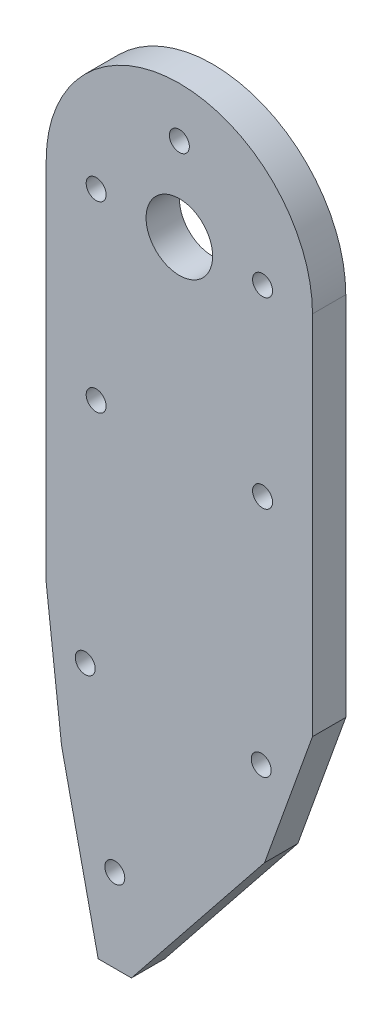
ISO-10303-21;
HEADER;
FILE_DESCRIPTION(('STEP AP214'),'2;1');
FILE_NAME('part.step','',(''),(''),'','','');
FILE_SCHEMA(('AUTOMOTIVE_DESIGN { 1 0 10303 214 1 1 1 1 }'));
ENDSEC;
DATA;
#1=APPLICATION_CONTEXT('core data for automotive mechanical design processes');
#2=APPLICATION_PROTOCOL_DEFINITION('international standard','automotive_design',2000,#1);
#3=PRODUCT_CONTEXT('',#1,'mechanical');
#4=PRODUCT('Part','Part','',(#3));
#5=PRODUCT_RELATED_PRODUCT_CATEGORY('part','',(#4));
#6=PRODUCT_DEFINITION_FORMATION('','',#4);
#7=PRODUCT_DEFINITION_CONTEXT('part definition',#1,'design');
#8=PRODUCT_DEFINITION('design','',#6,#7);
#9=PRODUCT_DEFINITION_SHAPE('','',#8);
#10=(LENGTH_UNIT() NAMED_UNIT(*) SI_UNIT(.MILLI.,.METRE.));
#11=(NAMED_UNIT(*) PLANE_ANGLE_UNIT() SI_UNIT($,.RADIAN.));
#12=(NAMED_UNIT(*) SI_UNIT($,.STERADIAN.) SOLID_ANGLE_UNIT());
#13=UNCERTAINTY_MEASURE_WITH_UNIT(LENGTH_MEASURE(1.E-05),#10,'distance_accuracy_value','');
#14=(GEOMETRIC_REPRESENTATION_CONTEXT(3) GLOBAL_UNCERTAINTY_ASSIGNED_CONTEXT((#13)) GLOBAL_UNIT_ASSIGNED_CONTEXT((#10,
#11,#12)) REPRESENTATION_CONTEXT('',''));
#15=CARTESIAN_POINT('',(0.,0.,0.));
#16=DIRECTION('',(0.,0.,1.));
#17=DIRECTION('',(1.,0.,0.));
#18=AXIS2_PLACEMENT_3D('',#15,#16,#17);
#19=CARTESIAN_POINT('',(-2.28220533650442,49.7410761607632,5.));
#20=DIRECTION('',(0.,0.,-1.));
#21=DIRECTION('',(-1.,0.,0.));
#22=AXIS2_PLACEMENT_3D('',#19,#20,#21);
#23=CYLINDRICAL_SURFACE('',#22,20.);
#24=CARTESIAN_POINT('',(-2.28220533650442,49.7410761607632,0.));
#25=DIRECTION('',(0.,0.,1.));
#26=DIRECTION('',(1.,0.,0.));
#27=AXIS2_PLACEMENT_3D('',#24,#25,#26);
#28=CIRCLE('',#27,20.);
#29=CARTESIAN_POINT('',(17.7177946634956,49.7410761607632,0.));
#30=VERTEX_POINT('',#29);
#31=CARTESIAN_POINT('',(-22.2822053365044,49.7410761607632,0.));
#32=VERTEX_POINT('',#31);
#33=EDGE_CURVE('E132',#30,#32,#28,.T.);
#34=ORIENTED_EDGE('',*,*,#33,.T.);
#35=DIRECTION('',(0.,0.,-1.));
#36=VECTOR('',#35,1.);
#37=CARTESIAN_POINT('',(-22.2822053365044,49.7410761607632,5.));
#38=LINE('',#37,#36);
#39=CARTESIAN_POINT('',(-22.2822053365044,49.7410761607632,5.));
#40=VERTEX_POINT('',#39);
#41=EDGE_CURVE('E11',#40,#32,#38,.T.);
#42=ORIENTED_EDGE('',*,*,#41,.F.);
#43=CARTESIAN_POINT('',(-2.28220533650442,49.7410761607632,5.));
#44=DIRECTION('',(0.,0.,1.));
#45=DIRECTION('',(1.,0.,0.));
#46=AXIS2_PLACEMENT_3D('',#43,#44,#45);
#47=CIRCLE('',#46,20.);
#48=CARTESIAN_POINT('',(17.7177946634956,49.7410761607632,5.));
#49=VERTEX_POINT('',#48);
#50=EDGE_CURVE('E147',#49,#40,#47,.T.);
#51=ORIENTED_EDGE('',*,*,#50,.F.);
#52=DIRECTION('',(0.,0.,-1.));
#53=VECTOR('',#52,1.);
#54=CARTESIAN_POINT('',(17.7177946634956,49.7410761607632,5.));
#55=LINE('',#54,#53);
#56=EDGE_CURVE('E128',#49,#30,#55,.T.);
#57=ORIENTED_EDGE('',*,*,#56,.T.);
#58=EDGE_LOOP('',(#34,#42,#51,#57));
#59=FACE_BOUND('',#58,.T.);
#60=ADVANCED_FACE('F36',(#59),#23,.T.);
#61=CARTESIAN_POINT('',(-22.2822053365044,49.7410761607632,5.));
#62=DIRECTION('',(1.,0.,0.));
#63=DIRECTION('',(0.,0.,-1.));
#64=AXIS2_PLACEMENT_3D('',#61,#62,#63);
#65=PLANE('',#64);
#66=DIRECTION('',(0.,-1.,0.));
#67=VECTOR('',#66,1.);
#68=CARTESIAN_POINT('',(-22.2822053365044,49.7410761607632,0.));
#69=LINE('',#68,#67);
#70=CARTESIAN_POINT('',(-22.2822053365044,-5.25892383923675,0.));
#71=VERTEX_POINT('',#70);
#72=EDGE_CURVE('E135',#32,#71,#69,.T.);
#73=ORIENTED_EDGE('',*,*,#72,.T.);
#74=DIRECTION('',(0.,0.,-1.));
#75=VECTOR('',#74,1.);
#76=CARTESIAN_POINT('',(-22.2822053365044,-5.25892383923675,5.));
#77=LINE('',#76,#75);
#78=CARTESIAN_POINT('',(-22.2822053365044,-5.25892383923675,5.));
#79=VERTEX_POINT('',#78);
#80=EDGE_CURVE('E44',#79,#71,#77,.T.);
#81=ORIENTED_EDGE('',*,*,#80,.F.);
#82=DIRECTION('',(0.,-1.,0.));
#83=VECTOR('',#82,1.);
#84=CARTESIAN_POINT('',(-22.2822053365044,49.7410761607632,5.));
#85=LINE('',#84,#83);
#86=EDGE_CURVE('E95',#40,#79,#85,.T.);
#87=ORIENTED_EDGE('',*,*,#86,.F.);
#88=ORIENTED_EDGE('',*,*,#41,.T.);
#89=EDGE_LOOP('',(#73,#81,#87,#88));
#90=FACE_BOUND('',#89,.T.);
#91=ADVANCED_FACE('F273',(#90),#65,.F.);
#92=CARTESIAN_POINT('',(-22.2822053365044,-5.25892383923675,5.));
#93=DIRECTION('',(0.993452373169035,0.114247022914439,0.));
#94=DIRECTION('',(-0.114247022914439,0.993452373169035,0.));
#95=AXIS2_PLACEMENT_3D('',#92,#93,#94);
#96=PLANE('',#95);
#97=DIRECTION('',(0.114247022914439,-0.993452373169035,0.));
#98=VECTOR('',#97,1.);
#99=CARTESIAN_POINT('',(-22.2822053365044,-5.25892383923675,0.));
#100=LINE('',#99,#98);
#101=CARTESIAN_POINT('',(-19.9822053365044,-25.2589238392367,0.));
#102=VERTEX_POINT('',#101);
#103=EDGE_CURVE('E138',#71,#102,#100,.T.);
#104=ORIENTED_EDGE('',*,*,#103,.T.);
#105=DIRECTION('',(0.,0.,-1.));
#106=VECTOR('',#105,1.);
#107=CARTESIAN_POINT('',(-19.9822053365044,-25.2589238392367,5.));
#108=LINE('',#107,#106);
#109=CARTESIAN_POINT('',(-19.9822053365044,-25.2589238392367,5.));
#110=VERTEX_POINT('',#109);
#111=EDGE_CURVE('E154',#110,#102,#108,.T.);
#112=ORIENTED_EDGE('',*,*,#111,.F.);
#113=DIRECTION('',(0.114247022914439,-0.993452373169035,0.));
#114=VECTOR('',#113,1.);
#115=CARTESIAN_POINT('',(-22.2822053365044,-5.25892383923675,5.));
#116=LINE('',#115,#114);
#117=EDGE_CURVE('E162',#79,#110,#116,.T.);
#118=ORIENTED_EDGE('',*,*,#117,.F.);
#119=ORIENTED_EDGE('',*,*,#80,.T.);
#120=EDGE_LOOP('',(#104,#112,#118,#119));
#121=FACE_BOUND('',#120,.T.);
#122=ADVANCED_FACE('F160',(#121),#96,.F.);
#123=CARTESIAN_POINT('',(-19.9822053365044,-25.2589238392367,5.));
#124=DIRECTION('',(0.97664446670509,0.21486178267512,0.));
#125=DIRECTION('',(-0.21486178267512,0.97664446670509,0.));
#126=AXIS2_PLACEMENT_3D('',#123,#124,#125);
#127=PLANE('',#126);
#128=DIRECTION('',(0.21486178267512,-0.97664446670509,0.));
#129=VECTOR('',#128,1.);
#130=CARTESIAN_POINT('',(-19.9822053365044,-25.2589238392367,0.));
#131=LINE('',#130,#129);
#132=CARTESIAN_POINT('',(-14.4822053365044,-50.2589238392367,0.));
#133=VERTEX_POINT('',#132);
#134=EDGE_CURVE('E140',#102,#133,#131,.T.);
#135=ORIENTED_EDGE('',*,*,#134,.T.);
#136=DIRECTION('',(0.,0.,-1.));
#137=VECTOR('',#136,1.);
#138=CARTESIAN_POINT('',(-14.4822053365044,-50.2589238392367,5.));
#139=LINE('',#138,#137);
#140=CARTESIAN_POINT('',(-14.4822053365044,-50.2589238392367,5.));
#141=VERTEX_POINT('',#140);
#142=EDGE_CURVE('E151',#141,#133,#139,.T.);
#143=ORIENTED_EDGE('',*,*,#142,.F.);
#144=DIRECTION('',(0.21486178267512,-0.97664446670509,0.));
#145=VECTOR('',#144,1.);
#146=CARTESIAN_POINT('',(-19.9822053365044,-25.2589238392367,5.));
#147=LINE('',#146,#145);
#148=EDGE_CURVE('E174',#110,#141,#147,.T.);
#149=ORIENTED_EDGE('',*,*,#148,.F.);
#150=ORIENTED_EDGE('',*,*,#111,.T.);
#151=EDGE_LOOP('',(#135,#143,#149,#150));
#152=FACE_BOUND('',#151,.T.);
#153=ADVANCED_FACE('F170',(#152),#127,.F.);
#154=CARTESIAN_POINT('',(-14.4822053365044,-50.2589238392367,5.));
#155=DIRECTION('',(0.,1.,0.));
#156=DIRECTION('',(0.,0.,1.));
#157=AXIS2_PLACEMENT_3D('',#154,#155,#156);
#158=PLANE('',#157);
#159=DIRECTION('',(1.,0.,0.));
#160=VECTOR('',#159,1.);
#161=CARTESIAN_POINT('',(-14.4822053365044,-50.2589238392367,0.));
#162=LINE('',#161,#160);
#163=CARTESIAN_POINT('',(-9.48220533650441,-50.2589238392367,0.));
#164=VERTEX_POINT('',#163);
#165=EDGE_CURVE('E142',#133,#164,#162,.T.);
#166=ORIENTED_EDGE('',*,*,#165,.T.);
#167=DIRECTION('',(0.,0.,-1.));
#168=VECTOR('',#167,1.);
#169=CARTESIAN_POINT('',(-9.48220533650441,-50.2589238392367,5.));
#170=LINE('',#169,#168);
#171=CARTESIAN_POINT('',(-9.48220533650441,-50.2589238392367,5.));
#172=VERTEX_POINT('',#171);
#173=EDGE_CURVE('E123',#172,#164,#170,.T.);
#174=ORIENTED_EDGE('',*,*,#173,.F.);
#175=DIRECTION('',(1.,0.,0.));
#176=VECTOR('',#175,1.);
#177=CARTESIAN_POINT('',(-14.4822053365044,-50.2589238392367,5.));
#178=LINE('',#177,#176);
#179=EDGE_CURVE('E114',#141,#172,#178,.T.);
#180=ORIENTED_EDGE('',*,*,#179,.F.);
#181=ORIENTED_EDGE('',*,*,#142,.T.);
#182=EDGE_LOOP('',(#166,#174,#180,#181));
#183=FACE_BOUND('',#182,.T.);
#184=ADVANCED_FACE('F173',(#183),#158,.F.);
#185=CARTESIAN_POINT('',(-9.48220533650441,-50.2589238392367,5.));
#186=DIRECTION('',(-0.78086880944303,0.624695047554424,0.));
#187=DIRECTION('',(-0.624695047554424,-0.78086880944303,0.));
#188=AXIS2_PLACEMENT_3D('',#185,#186,#187);
#189=PLANE('',#188);
#190=DIRECTION('',(0.624695047554424,0.78086880944303,0.));
#191=VECTOR('',#190,1.);
#192=CARTESIAN_POINT('',(-9.48220533650441,-50.2589238392367,0.));
#193=LINE('',#192,#191);
#194=CARTESIAN_POINT('',(10.5177946634956,-25.2589238392367,0.));
#195=VERTEX_POINT('',#194);
#196=EDGE_CURVE('E122',#164,#195,#193,.T.);
#197=ORIENTED_EDGE('',*,*,#196,.T.);
#198=DIRECTION('',(0.,0.,-1.));
#199=VECTOR('',#198,1.);
#200=CARTESIAN_POINT('',(10.5177946634956,-25.2589238392367,5.));
#201=LINE('',#200,#199);
#202=CARTESIAN_POINT('',(10.5177946634956,-25.2589238392367,5.));
#203=VERTEX_POINT('',#202);
#204=EDGE_CURVE('E119',#203,#195,#201,.T.);
#205=ORIENTED_EDGE('',*,*,#204,.F.);
#206=DIRECTION('',(0.624695047554424,0.78086880944303,0.));
#207=VECTOR('',#206,1.);
#208=CARTESIAN_POINT('',(-9.48220533650441,-50.2589238392367,5.));
#209=LINE('',#208,#207);
#210=EDGE_CURVE('E108',#172,#203,#209,.T.);
#211=ORIENTED_EDGE('',*,*,#210,.F.);
#212=ORIENTED_EDGE('',*,*,#173,.T.);
#213=EDGE_LOOP('',(#197,#205,#211,#212));
#214=FACE_BOUND('',#213,.T.);
#215=ADVANCED_FACE('F120',(#214),#189,.F.);
#216=CARTESIAN_POINT('',(10.5177946634956,-25.2589238392367,5.));
#217=DIRECTION('',(-0.940887411868727,0.338719468272741,0.));
#218=DIRECTION('',(-0.338719468272741,-0.940887411868727,0.));
#219=AXIS2_PLACEMENT_3D('',#216,#217,#218);
#220=PLANE('',#219);
#221=DIRECTION('',(0.338719468272741,0.940887411868727,0.));
#222=VECTOR('',#221,1.);
#223=CARTESIAN_POINT('',(10.5177946634956,-25.2589238392367,0.));
#224=LINE('',#223,#222);
#225=CARTESIAN_POINT('',(17.7177946634956,-5.25892383923675,0.));
#226=VERTEX_POINT('',#225);
#227=EDGE_CURVE('E81',#195,#226,#224,.T.);
#228=ORIENTED_EDGE('',*,*,#227,.T.);
#229=DIRECTION('',(0.,0.,-1.));
#230=VECTOR('',#229,1.);
#231=CARTESIAN_POINT('',(17.7177946634956,-5.25892383923675,5.));
#232=LINE('',#231,#230);
#233=CARTESIAN_POINT('',(17.7177946634956,-5.25892383923675,5.));
#234=VERTEX_POINT('',#233);
#235=EDGE_CURVE('E124',#234,#226,#232,.T.);
#236=ORIENTED_EDGE('',*,*,#235,.F.);
#237=DIRECTION('',(0.338719468272741,0.940887411868727,0.));
#238=VECTOR('',#237,1.);
#239=CARTESIAN_POINT('',(10.5177946634956,-25.2589238392367,5.));
#240=LINE('',#239,#238);
#241=EDGE_CURVE('E112',#203,#234,#240,.T.);
#242=ORIENTED_EDGE('',*,*,#241,.F.);
#243=ORIENTED_EDGE('',*,*,#204,.T.);
#244=EDGE_LOOP('',(#228,#236,#242,#243));
#245=FACE_BOUND('',#244,.T.);
#246=ADVANCED_FACE('F126',(#245),#220,.F.);
#247=CARTESIAN_POINT('',(17.7177946634956,-5.25892383923675,5.));
#248=DIRECTION('',(-1.,0.,0.));
#249=DIRECTION('',(0.,-1.,0.));
#250=AXIS2_PLACEMENT_3D('',#247,#248,#249);
#251=PLANE('',#250);
#252=DIRECTION('',(0.,1.,0.));
#253=VECTOR('',#252,1.);
#254=CARTESIAN_POINT('',(17.7177946634956,-5.25892383923675,0.));
#255=LINE('',#254,#253);
#256=EDGE_CURVE('E87',#226,#30,#255,.T.);
#257=ORIENTED_EDGE('',*,*,#256,.T.);
#258=ORIENTED_EDGE('',*,*,#56,.F.);
#259=DIRECTION('',(0.,1.,0.));
#260=VECTOR('',#259,1.);
#261=CARTESIAN_POINT('',(17.7177946634956,-5.25892383923675,5.));
#262=LINE('',#261,#260);
#263=EDGE_CURVE('E52',#234,#49,#262,.T.);
#264=ORIENTED_EDGE('',*,*,#263,.F.);
#265=ORIENTED_EDGE('',*,*,#235,.T.);
#266=EDGE_LOOP('',(#257,#258,#264,#265));
#267=FACE_BOUND('',#266,.T.);
#268=ADVANCED_FACE('F239',(#267),#251,.F.);
#269=CARTESIAN_POINT('',(-2.28220533650442,49.7410761607632,5.));
#270=DIRECTION('',(0.,0.,1.));
#271=DIRECTION('',(1.,0.,0.));
#272=AXIS2_PLACEMENT_3D('',#269,#270,#271);
#273=PLANE('',#272);
#274=CARTESIAN_POINT('',(-11.9822053365044,-37.7589238392368,5.));
#275=DIRECTION('',(0.,0.,1.));
#276=DIRECTION('',(1.,0.,0.));
#277=AXIS2_PLACEMENT_3D('',#274,#275,#276);
#278=CIRCLE('',#277,1.5);
#279=CARTESIAN_POINT('',(-10.4822053365044,-37.7589238392368,5.));
#280=VERTEX_POINT('',#279);
#281=EDGE_CURVE('E197',#280,#280,#278,.T.);
#282=ORIENTED_EDGE('',*,*,#281,.F.);
#283=EDGE_LOOP('',(#282));
#284=FACE_BOUND('',#283,.T.);
#285=CARTESIAN_POINT('',(10.0177946634956,-12.7589238392368,5.));
#286=DIRECTION('',(0.,0.,1.));
#287=DIRECTION('',(1.,0.,0.));
#288=AXIS2_PLACEMENT_3D('',#285,#286,#287);
#289=CIRCLE('',#288,1.5);
#290=CARTESIAN_POINT('',(11.5177946634956,-12.7589238392368,5.));
#291=VERTEX_POINT('',#290);
#292=EDGE_CURVE('E212',#291,#291,#289,.T.);
#293=ORIENTED_EDGE('',*,*,#292,.F.);
#294=EDGE_LOOP('',(#293));
#295=FACE_BOUND('',#294,.T.);
#296=CARTESIAN_POINT('',(-16.4197053365044,-12.7589238392368,5.));
#297=DIRECTION('',(0.,0.,1.));
#298=DIRECTION('',(1.,0.,0.));
#299=AXIS2_PLACEMENT_3D('',#296,#297,#298);
#300=CIRCLE('',#299,1.5);
#301=CARTESIAN_POINT('',(-14.9197053365044,-12.7589238392368,5.));
#302=VERTEX_POINT('',#301);
#303=EDGE_CURVE('E219',#302,#302,#300,.T.);
#304=ORIENTED_EDGE('',*,*,#303,.F.);
#305=EDGE_LOOP('',(#304));
#306=FACE_BOUND('',#305,.T.);
#307=CARTESIAN_POINT('',(-14.7822053365044,22.2410761607632,5.));
#308=DIRECTION('',(0.,0.,1.));
#309=DIRECTION('',(1.,0.,0.));
#310=AXIS2_PLACEMENT_3D('',#307,#308,#309);
#311=CIRCLE('',#310,1.5);
#312=CARTESIAN_POINT('',(-13.2822053365044,22.2410761607632,5.));
#313=VERTEX_POINT('',#312);
#314=EDGE_CURVE('E207',#313,#313,#311,.T.);
#315=ORIENTED_EDGE('',*,*,#314,.F.);
#316=EDGE_LOOP('',(#315));
#317=FACE_BOUND('',#316,.T.);
#318=CARTESIAN_POINT('',(-14.7822053365044,49.7410761607632,5.));
#319=DIRECTION('',(0.,0.,1.));
#320=DIRECTION('',(1.,0.,0.));
#321=AXIS2_PLACEMENT_3D('',#318,#319,#320);
#322=CIRCLE('',#321,1.5);
#323=CARTESIAN_POINT('',(-13.2822053365044,49.7410761607632,5.));
#324=VERTEX_POINT('',#323);
#325=EDGE_CURVE('E194',#324,#324,#322,.T.);
#326=ORIENTED_EDGE('',*,*,#325,.F.);
#327=EDGE_LOOP('',(#326));
#328=FACE_BOUND('',#327,.T.);
#329=CARTESIAN_POINT('',(10.2177946634956,49.7410761607632,5.));
#330=DIRECTION('',(0.,0.,1.));
#331=DIRECTION('',(1.,0.,0.));
#332=AXIS2_PLACEMENT_3D('',#329,#330,#331);
#333=CIRCLE('',#332,1.5);
#334=CARTESIAN_POINT('',(11.7177946634956,49.7410761607632,5.));
#335=VERTEX_POINT('',#334);
#336=EDGE_CURVE('E186',#335,#335,#333,.T.);
#337=ORIENTED_EDGE('',*,*,#336,.F.);
#338=EDGE_LOOP('',(#337));
#339=FACE_BOUND('',#338,.T.);
#340=CARTESIAN_POINT('',(-2.28220533650442,62.2410761607632,5.));
#341=DIRECTION('',(0.,0.,1.));
#342=DIRECTION('',(1.,0.,0.));
#343=AXIS2_PLACEMENT_3D('',#340,#341,#342);
#344=CIRCLE('',#343,1.5);
#345=CARTESIAN_POINT('',(-0.782205336504416,62.2410761607632,5.));
#346=VERTEX_POINT('',#345);
#347=EDGE_CURVE('E193',#346,#346,#344,.T.);
#348=ORIENTED_EDGE('',*,*,#347,.F.);
#349=EDGE_LOOP('',(#348));
#350=FACE_BOUND('',#349,.T.);
#351=CARTESIAN_POINT('',(10.2177946634956,22.2410761607632,5.));
#352=DIRECTION('',(0.,0.,1.));
#353=DIRECTION('',(1.,0.,0.));
#354=AXIS2_PLACEMENT_3D('',#351,#352,#353);
#355=CIRCLE('',#354,1.5);
#356=CARTESIAN_POINT('',(11.7177946634956,22.2410761607632,5.));
#357=VERTEX_POINT('',#356);
#358=EDGE_CURVE('E200',#357,#357,#355,.T.);
#359=ORIENTED_EDGE('',*,*,#358,.F.);
#360=EDGE_LOOP('',(#359));
#361=FACE_BOUND('',#360,.T.);
#362=CARTESIAN_POINT('',(-2.28220533650442,49.7410761607632,5.));
#363=DIRECTION('',(0.,0.,1.));
#364=DIRECTION('',(1.,0.,0.));
#365=AXIS2_PLACEMENT_3D('',#362,#363,#364);
#366=CIRCLE('',#365,5.);
#367=CARTESIAN_POINT('',(2.71779466349558,49.7410761607632,5.));
#368=VERTEX_POINT('',#367);
#369=EDGE_CURVE('E182',#368,#368,#366,.T.);
#370=ORIENTED_EDGE('',*,*,#369,.F.);
#371=EDGE_LOOP('',(#370));
#372=FACE_BOUND('',#371,.T.);
#373=ORIENTED_EDGE('',*,*,#50,.T.);
#374=ORIENTED_EDGE('',*,*,#86,.T.);
#375=ORIENTED_EDGE('',*,*,#117,.T.);
#376=ORIENTED_EDGE('',*,*,#148,.T.);
#377=ORIENTED_EDGE('',*,*,#179,.T.);
#378=ORIENTED_EDGE('',*,*,#210,.T.);
#379=ORIENTED_EDGE('',*,*,#241,.T.);
#380=ORIENTED_EDGE('',*,*,#263,.T.);
#381=EDGE_LOOP('',(#373,#374,#375,#376,#377,#378,#379,#380));
#382=FACE_BOUND('',#381,.T.);
#383=ADVANCED_FACE('F110',(#284,#295,#306,#317,#328,#339,#350,#361,#372,#382),#273,.T.);
#384=CARTESIAN_POINT('',(-2.28220533650442,49.7410761607632,0.));
#385=DIRECTION('',(0.,0.,1.));
#386=DIRECTION('',(1.,0.,0.));
#387=AXIS2_PLACEMENT_3D('',#384,#385,#386);
#388=PLANE('',#387);
#389=CARTESIAN_POINT('',(-11.9822053365044,-37.7589238392368,0.));
#390=DIRECTION('',(0.,0.,1.));
#391=DIRECTION('',(1.,0.,0.));
#392=AXIS2_PLACEMENT_3D('',#389,#390,#391);
#393=CIRCLE('',#392,1.5);
#394=CARTESIAN_POINT('',(-10.4822053365044,-37.7589238392368,0.));
#395=VERTEX_POINT('',#394);
#396=EDGE_CURVE('E185',#395,#395,#393,.F.);
#397=ORIENTED_EDGE('',*,*,#396,.F.);
#398=EDGE_LOOP('',(#397));
#399=FACE_BOUND('',#398,.T.);
#400=CARTESIAN_POINT('',(10.0177946634956,-12.7589238392368,0.));
#401=DIRECTION('',(0.,0.,1.));
#402=DIRECTION('',(1.,0.,0.));
#403=AXIS2_PLACEMENT_3D('',#400,#401,#402);
#404=CIRCLE('',#403,1.5);
#405=CARTESIAN_POINT('',(11.5177946634956,-12.7589238392368,0.));
#406=VERTEX_POINT('',#405);
#407=EDGE_CURVE('E216',#406,#406,#404,.F.);
#408=ORIENTED_EDGE('',*,*,#407,.F.);
#409=EDGE_LOOP('',(#408));
#410=FACE_BOUND('',#409,.T.);
#411=CARTESIAN_POINT('',(-16.4197053365044,-12.7589238392368,0.));
#412=DIRECTION('',(0.,0.,1.));
#413=DIRECTION('',(1.,0.,0.));
#414=AXIS2_PLACEMENT_3D('',#411,#412,#413);
#415=CIRCLE('',#414,1.5);
#416=CARTESIAN_POINT('',(-14.9197053365044,-12.7589238392368,0.));
#417=VERTEX_POINT('',#416);
#418=EDGE_CURVE('E215',#417,#417,#415,.F.);
#419=ORIENTED_EDGE('',*,*,#418,.F.);
#420=EDGE_LOOP('',(#419));
#421=FACE_BOUND('',#420,.T.);
#422=CARTESIAN_POINT('',(-14.7822053365044,22.2410761607632,0.));
#423=DIRECTION('',(0.,0.,1.));
#424=DIRECTION('',(1.,0.,0.));
#425=AXIS2_PLACEMENT_3D('',#422,#423,#424);
#426=CIRCLE('',#425,1.5);
#427=CARTESIAN_POINT('',(-13.2822053365044,22.2410761607632,0.));
#428=VERTEX_POINT('',#427);
#429=EDGE_CURVE('E222',#428,#428,#426,.F.);
#430=ORIENTED_EDGE('',*,*,#429,.F.);
#431=EDGE_LOOP('',(#430));
#432=FACE_BOUND('',#431,.T.);
#433=CARTESIAN_POINT('',(-14.7822053365044,49.7410761607632,0.));
#434=DIRECTION('',(0.,0.,1.));
#435=DIRECTION('',(1.,0.,0.));
#436=AXIS2_PLACEMENT_3D('',#433,#434,#435);
#437=CIRCLE('',#436,1.5);
#438=CARTESIAN_POINT('',(-13.2822053365044,49.7410761607632,0.));
#439=VERTEX_POINT('',#438);
#440=EDGE_CURVE('E189',#439,#439,#437,.F.);
#441=ORIENTED_EDGE('',*,*,#440,.F.);
#442=EDGE_LOOP('',(#441));
#443=FACE_BOUND('',#442,.T.);
#444=CARTESIAN_POINT('',(10.2177946634956,49.7410761607632,0.));
#445=DIRECTION('',(0.,0.,1.));
#446=DIRECTION('',(1.,0.,0.));
#447=AXIS2_PLACEMENT_3D('',#444,#445,#446);
#448=CIRCLE('',#447,1.5);
#449=CARTESIAN_POINT('',(11.7177946634956,49.7410761607632,0.));
#450=VERTEX_POINT('',#449);
#451=EDGE_CURVE('E190',#450,#450,#448,.F.);
#452=ORIENTED_EDGE('',*,*,#451,.F.);
#453=EDGE_LOOP('',(#452));
#454=FACE_BOUND('',#453,.T.);
#455=CARTESIAN_POINT('',(-2.28220533650442,62.2410761607632,0.));
#456=DIRECTION('',(0.,0.,1.));
#457=DIRECTION('',(1.,0.,0.));
#458=AXIS2_PLACEMENT_3D('',#455,#456,#457);
#459=CIRCLE('',#458,1.5);
#460=CARTESIAN_POINT('',(-0.782205336504416,62.2410761607632,0.));
#461=VERTEX_POINT('',#460);
#462=EDGE_CURVE('E203',#461,#461,#459,.F.);
#463=ORIENTED_EDGE('',*,*,#462,.F.);
#464=EDGE_LOOP('',(#463));
#465=FACE_BOUND('',#464,.T.);
#466=CARTESIAN_POINT('',(10.2177946634956,22.2410761607632,0.));
#467=DIRECTION('',(0.,0.,1.));
#468=DIRECTION('',(1.,0.,0.));
#469=AXIS2_PLACEMENT_3D('',#466,#467,#468);
#470=CIRCLE('',#469,1.5);
#471=CARTESIAN_POINT('',(11.7177946634956,22.2410761607632,0.));
#472=VERTEX_POINT('',#471);
#473=EDGE_CURVE('E204',#472,#472,#470,.F.);
#474=ORIENTED_EDGE('',*,*,#473,.F.);
#475=EDGE_LOOP('',(#474));
#476=FACE_BOUND('',#475,.T.);
#477=CARTESIAN_POINT('',(-2.28220533650442,49.7410761607632,0.));
#478=DIRECTION('',(0.,0.,1.));
#479=DIRECTION('',(1.,0.,0.));
#480=AXIS2_PLACEMENT_3D('',#477,#478,#479);
#481=CIRCLE('',#480,5.);
#482=CARTESIAN_POINT('',(2.71779466349558,49.7410761607632,0.));
#483=VERTEX_POINT('',#482);
#484=EDGE_CURVE('E136',#483,#483,#481,.F.);
#485=ORIENTED_EDGE('',*,*,#484,.F.);
#486=EDGE_LOOP('',(#485));
#487=FACE_BOUND('',#486,.T.);
#488=ORIENTED_EDGE('',*,*,#33,.F.);
#489=ORIENTED_EDGE('',*,*,#256,.F.);
#490=ORIENTED_EDGE('',*,*,#227,.F.);
#491=ORIENTED_EDGE('',*,*,#196,.F.);
#492=ORIENTED_EDGE('',*,*,#165,.F.);
#493=ORIENTED_EDGE('',*,*,#134,.F.);
#494=ORIENTED_EDGE('',*,*,#103,.F.);
#495=ORIENTED_EDGE('',*,*,#72,.F.);
#496=EDGE_LOOP('',(#488,#489,#490,#491,#492,#493,#494,#495));
#497=FACE_BOUND('',#496,.T.);
#498=ADVANCED_FACE('F166',(#399,#410,#421,#432,#443,#454,#465,#476,#487,#497),#388,.F.);
#499=CARTESIAN_POINT('',(-2.28220533650442,49.7410761607632,-14.1421356237309));
#500=DIRECTION('',(0.,0.,1.));
#501=DIRECTION('',(1.,0.,0.));
#502=AXIS2_PLACEMENT_3D('',#499,#500,#501);
#503=CYLINDRICAL_SURFACE('',#502,5.);
#504=ORIENTED_EDGE('',*,*,#484,.T.);
#505=EDGE_LOOP('',(#504));
#506=FACE_BOUND('',#505,.T.);
#507=ORIENTED_EDGE('',*,*,#369,.T.);
#508=EDGE_LOOP('',(#507));
#509=FACE_BOUND('',#508,.T.);
#510=ADVANCED_FACE('F257',(#506,#509),#503,.F.);
#511=CARTESIAN_POINT('',(10.2177946634956,22.2410761607632,-0.00100000000000013));
#512=DIRECTION('',(0.,0.,1.));
#513=DIRECTION('',(1.,0.,0.));
#514=AXIS2_PLACEMENT_3D('',#511,#512,#513);
#515=CYLINDRICAL_SURFACE('',#514,1.5);
#516=ORIENTED_EDGE('',*,*,#358,.T.);
#517=EDGE_LOOP('',(#516));
#518=FACE_BOUND('',#517,.T.);
#519=ORIENTED_EDGE('',*,*,#473,.T.);
#520=EDGE_LOOP('',(#519));
#521=FACE_BOUND('',#520,.T.);
#522=ADVANCED_FACE('F259',(#518,#521),#515,.F.);
#523=CARTESIAN_POINT('',(-2.28220533650442,62.2410761607632,-0.00100000000000013));
#524=DIRECTION('',(0.,0.,1.));
#525=DIRECTION('',(1.,0.,0.));
#526=AXIS2_PLACEMENT_3D('',#523,#524,#525);
#527=CYLINDRICAL_SURFACE('',#526,1.5);
#528=ORIENTED_EDGE('',*,*,#347,.T.);
#529=EDGE_LOOP('',(#528));
#530=FACE_BOUND('',#529,.T.);
#531=ORIENTED_EDGE('',*,*,#462,.T.);
#532=EDGE_LOOP('',(#531));
#533=FACE_BOUND('',#532,.T.);
#534=ADVANCED_FACE('F266',(#530,#533),#527,.F.);
#535=CARTESIAN_POINT('',(10.2177946634956,49.7410761607632,-0.00100000000000013));
#536=DIRECTION('',(0.,0.,1.));
#537=DIRECTION('',(1.,0.,0.));
#538=AXIS2_PLACEMENT_3D('',#535,#536,#537);
#539=CYLINDRICAL_SURFACE('',#538,1.5);
#540=ORIENTED_EDGE('',*,*,#336,.T.);
#541=EDGE_LOOP('',(#540));
#542=FACE_BOUND('',#541,.T.);
#543=ORIENTED_EDGE('',*,*,#451,.T.);
#544=EDGE_LOOP('',(#543));
#545=FACE_BOUND('',#544,.T.);
#546=ADVANCED_FACE('F355',(#542,#545),#539,.F.);
#547=CARTESIAN_POINT('',(-14.7822053365044,49.7410761607632,-0.00100000000000013));
#548=DIRECTION('',(0.,0.,1.));
#549=DIRECTION('',(1.,0.,0.));
#550=AXIS2_PLACEMENT_3D('',#547,#548,#549);
#551=CYLINDRICAL_SURFACE('',#550,1.5);
#552=ORIENTED_EDGE('',*,*,#325,.T.);
#553=EDGE_LOOP('',(#552));
#554=FACE_BOUND('',#553,.T.);
#555=ORIENTED_EDGE('',*,*,#440,.T.);
#556=EDGE_LOOP('',(#555));
#557=FACE_BOUND('',#556,.T.);
#558=ADVANCED_FACE('F366',(#554,#557),#551,.F.);
#559=CARTESIAN_POINT('',(-14.7822053365044,22.2410761607632,-0.00100000000000013));
#560=DIRECTION('',(0.,0.,1.));
#561=DIRECTION('',(1.,0.,0.));
#562=AXIS2_PLACEMENT_3D('',#559,#560,#561);
#563=CYLINDRICAL_SURFACE('',#562,1.5);
#564=ORIENTED_EDGE('',*,*,#314,.T.);
#565=EDGE_LOOP('',(#564));
#566=FACE_BOUND('',#565,.T.);
#567=ORIENTED_EDGE('',*,*,#429,.T.);
#568=EDGE_LOOP('',(#567));
#569=FACE_BOUND('',#568,.T.);
#570=ADVANCED_FACE('F376',(#566,#569),#563,.F.);
#571=CARTESIAN_POINT('',(-16.4197053365044,-12.7589238392368,-0.00100000000000013));
#572=DIRECTION('',(0.,0.,1.));
#573=DIRECTION('',(1.,0.,0.));
#574=AXIS2_PLACEMENT_3D('',#571,#572,#573);
#575=CYLINDRICAL_SURFACE('',#574,1.5);
#576=ORIENTED_EDGE('',*,*,#303,.T.);
#577=EDGE_LOOP('',(#576));
#578=FACE_BOUND('',#577,.T.);
#579=ORIENTED_EDGE('',*,*,#418,.T.);
#580=EDGE_LOOP('',(#579));
#581=FACE_BOUND('',#580,.T.);
#582=ADVANCED_FACE('F387',(#578,#581),#575,.F.);
#583=CARTESIAN_POINT('',(10.0177946634956,-12.7589238392368,-0.00100000000000013));
#584=DIRECTION('',(0.,0.,1.));
#585=DIRECTION('',(1.,0.,0.));
#586=AXIS2_PLACEMENT_3D('',#583,#584,#585);
#587=CYLINDRICAL_SURFACE('',#586,1.5);
#588=ORIENTED_EDGE('',*,*,#292,.T.);
#589=EDGE_LOOP('',(#588));
#590=FACE_BOUND('',#589,.T.);
#591=ORIENTED_EDGE('',*,*,#407,.T.);
#592=EDGE_LOOP('',(#591));
#593=FACE_BOUND('',#592,.T.);
#594=ADVANCED_FACE('F398',(#590,#593),#587,.F.);
#595=CARTESIAN_POINT('',(-11.9822053365044,-37.7589238392368,-0.00100000000000013));
#596=DIRECTION('',(0.,0.,1.));
#597=DIRECTION('',(1.,0.,0.));
#598=AXIS2_PLACEMENT_3D('',#595,#596,#597);
#599=CYLINDRICAL_SURFACE('',#598,1.5);
#600=ORIENTED_EDGE('',*,*,#281,.T.);
#601=EDGE_LOOP('',(#600));
#602=FACE_BOUND('',#601,.T.);
#603=ORIENTED_EDGE('',*,*,#396,.T.);
#604=EDGE_LOOP('',(#603));
#605=FACE_BOUND('',#604,.T.);
#606=ADVANCED_FACE('F234',(#602,#605),#599,.F.);
#607=CLOSED_SHELL('',(#60,#91,#122,#153,#184,#215,#246,#268,#383,#498,#510,#522,#534,#546,#558,
#570,#582,#594,#606));
#608=MANIFOLD_SOLID_BREP('B2',#607);
#609=ADVANCED_BREP_SHAPE_REPRESENTATION('',(#18,#608),#14);
#610=SHAPE_DEFINITION_REPRESENTATION(#9,#609);
ENDSEC;
END-ISO-10303-21;
